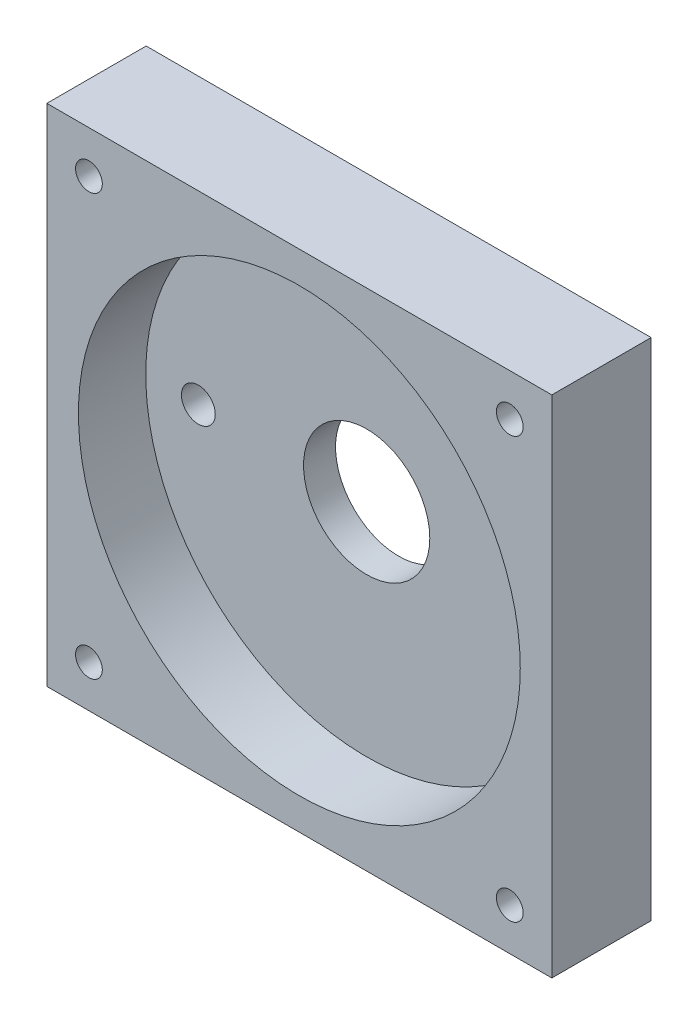
ISO-10303-21;
HEADER;
FILE_DESCRIPTION(('STEP AP214'),'2;1');
FILE_NAME('part.step','',(''),(''),'','','');
FILE_SCHEMA(('AUTOMOTIVE_DESIGN { 1 0 10303 214 1 1 1 1 }'));
ENDSEC;
DATA;
#1=APPLICATION_CONTEXT('core data for automotive mechanical design processes');
#2=APPLICATION_PROTOCOL_DEFINITION('international standard','automotive_design',2000,#1);
#3=PRODUCT_CONTEXT('',#1,'mechanical');
#4=PRODUCT('Part','Part','',(#3));
#5=PRODUCT_RELATED_PRODUCT_CATEGORY('part','',(#4));
#6=PRODUCT_DEFINITION_FORMATION('','',#4);
#7=PRODUCT_DEFINITION_CONTEXT('part definition',#1,'design');
#8=PRODUCT_DEFINITION('design','',#6,#7);
#9=PRODUCT_DEFINITION_SHAPE('','',#8);
#10=(LENGTH_UNIT() NAMED_UNIT(*) SI_UNIT(.MILLI.,.METRE.));
#11=(NAMED_UNIT(*) PLANE_ANGLE_UNIT() SI_UNIT($,.RADIAN.));
#12=(NAMED_UNIT(*) SI_UNIT($,.STERADIAN.) SOLID_ANGLE_UNIT());
#13=UNCERTAINTY_MEASURE_WITH_UNIT(LENGTH_MEASURE(1.E-05),#10,'distance_accuracy_value','');
#14=(GEOMETRIC_REPRESENTATION_CONTEXT(3) GLOBAL_UNCERTAINTY_ASSIGNED_CONTEXT((#13)) GLOBAL_UNIT_ASSIGNED_CONTEXT((#10,
#11,#12)) REPRESENTATION_CONTEXT('',''));
#15=CARTESIAN_POINT('',(0.,0.,0.));
#16=DIRECTION('',(0.,0.,1.));
#17=DIRECTION('',(1.,0.,0.));
#18=AXIS2_PLACEMENT_3D('',#15,#16,#17);
#19=CARTESIAN_POINT('',(38.1,-38.1,12.7));
#20=DIRECTION('',(-1.,0.,0.));
#21=DIRECTION('',(0.,0.,1.));
#22=AXIS2_PLACEMENT_3D('',#19,#20,#21);
#23=PLANE('',#22);
#24=DIRECTION('',(0.,0.,-1.));
#25=VECTOR('',#24,1.);
#26=CARTESIAN_POINT('',(38.1,-38.1,12.7));
#27=LINE('',#26,#25);
#28=CARTESIAN_POINT('',(38.1,-38.1,12.7));
#29=VERTEX_POINT('',#28);
#30=CARTESIAN_POINT('',(38.1,-38.1,-2.286));
#31=VERTEX_POINT('',#30);
#32=EDGE_CURVE('E96',#29,#31,#27,.T.);
#33=ORIENTED_EDGE('',*,*,#32,.T.);
#34=DIRECTION('',(0.,-1.,0.));
#35=VECTOR('',#34,1.);
#36=CARTESIAN_POINT('',(38.1,-38.1,-2.286));
#37=LINE('',#36,#35);
#38=CARTESIAN_POINT('',(38.1,38.1,-2.286));
#39=VERTEX_POINT('',#38);
#40=EDGE_CURVE('E95',#39,#31,#37,.T.);
#41=ORIENTED_EDGE('',*,*,#40,.F.);
#42=DIRECTION('',(0.,0.,-1.));
#43=VECTOR('',#42,1.);
#44=CARTESIAN_POINT('',(38.1,38.1,12.7));
#45=LINE('',#44,#43);
#46=CARTESIAN_POINT('',(38.1,38.1,12.7));
#47=VERTEX_POINT('',#46);
#48=EDGE_CURVE('E11',#47,#39,#45,.T.);
#49=ORIENTED_EDGE('',*,*,#48,.F.);
#50=DIRECTION('',(0.,1.,0.));
#51=VECTOR('',#50,1.);
#52=CARTESIAN_POINT('',(38.1,-38.1,12.7));
#53=LINE('',#52,#51);
#54=EDGE_CURVE('E144',#29,#47,#53,.T.);
#55=ORIENTED_EDGE('',*,*,#54,.F.);
#56=EDGE_LOOP('',(#33,#41,#49,#55));
#57=FACE_BOUND('',#56,.T.);
#58=ADVANCED_FACE('F41',(#57),#23,.F.);
#59=CARTESIAN_POINT('',(-38.1,38.1,12.7));
#60=DIRECTION('',(0.,-1.,0.));
#61=DIRECTION('',(0.,0.,-1.));
#62=AXIS2_PLACEMENT_3D('',#59,#60,#61);
#63=PLANE('',#62);
#64=ORIENTED_EDGE('',*,*,#48,.T.);
#65=DIRECTION('',(1.,0.,0.));
#66=VECTOR('',#65,1.);
#67=CARTESIAN_POINT('',(38.1,38.1,-2.286));
#68=LINE('',#67,#66);
#69=CARTESIAN_POINT('',(-38.1,38.1,-2.286));
#70=VERTEX_POINT('',#69);
#71=EDGE_CURVE('E90',#70,#39,#68,.T.);
#72=ORIENTED_EDGE('',*,*,#71,.F.);
#73=DIRECTION('',(0.,0.,-1.));
#74=VECTOR('',#73,1.);
#75=CARTESIAN_POINT('',(-38.1,38.1,12.7));
#76=LINE('',#75,#74);
#77=CARTESIAN_POINT('',(-38.1,38.1,12.7));
#78=VERTEX_POINT('',#77);
#79=EDGE_CURVE('E49',#78,#70,#76,.T.);
#80=ORIENTED_EDGE('',*,*,#79,.F.);
#81=DIRECTION('',(-1.,0.,0.));
#82=VECTOR('',#81,1.);
#83=CARTESIAN_POINT('',(-38.1,38.1,12.7));
#84=LINE('',#83,#82);
#85=EDGE_CURVE('E91',#47,#78,#84,.T.);
#86=ORIENTED_EDGE('',*,*,#85,.F.);
#87=EDGE_LOOP('',(#64,#72,#80,#86));
#88=FACE_BOUND('',#87,.T.);
#89=ADVANCED_FACE('F87',(#88),#63,.F.);
#90=CARTESIAN_POINT('',(-38.1,-38.1,12.7));
#91=DIRECTION('',(1.,0.,0.));
#92=DIRECTION('',(0.,0.,-1.));
#93=AXIS2_PLACEMENT_3D('',#90,#91,#92);
#94=PLANE('',#93);
#95=ORIENTED_EDGE('',*,*,#79,.T.);
#96=DIRECTION('',(0.,1.,0.));
#97=VECTOR('',#96,1.);
#98=CARTESIAN_POINT('',(-38.1,38.1,-2.286));
#99=LINE('',#98,#97);
#100=CARTESIAN_POINT('',(-38.1,-38.1,-2.286));
#101=VERTEX_POINT('',#100);
#102=EDGE_CURVE('E106',#101,#70,#99,.T.);
#103=ORIENTED_EDGE('',*,*,#102,.F.);
#104=DIRECTION('',(0.,0.,-1.));
#105=VECTOR('',#104,1.);
#106=CARTESIAN_POINT('',(-38.1,-38.1,12.7));
#107=LINE('',#106,#105);
#108=CARTESIAN_POINT('',(-38.1,-38.1,12.7));
#109=VERTEX_POINT('',#108);
#110=EDGE_CURVE('E156',#109,#101,#107,.T.);
#111=ORIENTED_EDGE('',*,*,#110,.F.);
#112=DIRECTION('',(0.,-1.,0.));
#113=VECTOR('',#112,1.);
#114=CARTESIAN_POINT('',(-38.1,-38.1,12.7));
#115=LINE('',#114,#113);
#116=EDGE_CURVE('E64',#78,#109,#115,.T.);
#117=ORIENTED_EDGE('',*,*,#116,.F.);
#118=EDGE_LOOP('',(#95,#103,#111,#117));
#119=FACE_BOUND('',#118,.T.);
#120=ADVANCED_FACE('F192',(#119),#94,.F.);
#121=CARTESIAN_POINT('',(-38.1,-38.1,12.7));
#122=DIRECTION('',(0.,1.,0.));
#123=DIRECTION('',(0.,0.,1.));
#124=AXIS2_PLACEMENT_3D('',#121,#122,#123);
#125=PLANE('',#124);
#126=ORIENTED_EDGE('',*,*,#110,.T.);
#127=DIRECTION('',(-1.,0.,0.));
#128=VECTOR('',#127,1.);
#129=CARTESIAN_POINT('',(-38.1,-38.1,-2.286));
#130=LINE('',#129,#128);
#131=EDGE_CURVE('E100',#31,#101,#130,.T.);
#132=ORIENTED_EDGE('',*,*,#131,.F.);
#133=ORIENTED_EDGE('',*,*,#32,.F.);
#134=DIRECTION('',(1.,0.,0.));
#135=VECTOR('',#134,1.);
#136=CARTESIAN_POINT('',(-38.1,-38.1,12.7));
#137=LINE('',#136,#135);
#138=EDGE_CURVE('E57',#109,#29,#137,.T.);
#139=ORIENTED_EDGE('',*,*,#138,.F.);
#140=EDGE_LOOP('',(#126,#132,#133,#139));
#141=FACE_BOUND('',#140,.T.);
#142=ADVANCED_FACE('F188',(#141),#125,.F.);
#143=CARTESIAN_POINT('',(0.,0.,12.7));
#144=DIRECTION('',(0.,0.,-1.));
#145=DIRECTION('',(-1.,0.,0.));
#146=AXIS2_PLACEMENT_3D('',#143,#144,#145);
#147=PLANE('',#146);
#148=CARTESIAN_POINT('',(-31.75,31.75,12.7));
#149=DIRECTION('',(0.,0.,1.));
#150=DIRECTION('',(1.,0.,0.));
#151=AXIS2_PLACEMENT_3D('',#148,#149,#150);
#152=CIRCLE('',#151,2.0193);
#153=CARTESIAN_POINT('',(-29.7307,31.75,12.7));
#154=VERTEX_POINT('',#153);
#155=EDGE_CURVE('E120',#154,#154,#152,.T.);
#156=ORIENTED_EDGE('',*,*,#155,.F.);
#157=EDGE_LOOP('',(#156));
#158=FACE_BOUND('',#157,.T.);
#159=CARTESIAN_POINT('',(-31.75,-31.75,12.7));
#160=DIRECTION('',(0.,0.,1.));
#161=DIRECTION('',(1.,0.,0.));
#162=AXIS2_PLACEMENT_3D('',#159,#160,#161);
#163=CIRCLE('',#162,2.0193);
#164=CARTESIAN_POINT('',(-29.7307,-31.75,12.7));
#165=VERTEX_POINT('',#164);
#166=EDGE_CURVE('E124',#165,#165,#163,.T.);
#167=ORIENTED_EDGE('',*,*,#166,.F.);
#168=EDGE_LOOP('',(#167));
#169=FACE_BOUND('',#168,.T.);
#170=CARTESIAN_POINT('',(31.75,-31.75,12.7));
#171=DIRECTION('',(0.,0.,1.));
#172=DIRECTION('',(1.,0.,0.));
#173=AXIS2_PLACEMENT_3D('',#170,#171,#172);
#174=CIRCLE('',#173,2.0193);
#175=CARTESIAN_POINT('',(33.7693,-31.75,12.7));
#176=VERTEX_POINT('',#175);
#177=EDGE_CURVE('E128',#176,#176,#174,.T.);
#178=ORIENTED_EDGE('',*,*,#177,.F.);
#179=EDGE_LOOP('',(#178));
#180=FACE_BOUND('',#179,.T.);
#181=CARTESIAN_POINT('',(31.75,31.75,12.7));
#182=DIRECTION('',(0.,0.,1.));
#183=DIRECTION('',(1.,0.,0.));
#184=AXIS2_PLACEMENT_3D('',#181,#182,#183);
#185=CIRCLE('',#184,2.0193);
#186=CARTESIAN_POINT('',(33.7693,31.75,12.7));
#187=VERTEX_POINT('',#186);
#188=EDGE_CURVE('E131',#187,#187,#185,.T.);
#189=ORIENTED_EDGE('',*,*,#188,.F.);
#190=EDGE_LOOP('',(#189));
#191=FACE_BOUND('',#190,.T.);
#192=CARTESIAN_POINT('',(0.,0.,12.7));
#193=DIRECTION('',(0.,0.,1.));
#194=DIRECTION('',(1.,0.,0.));
#195=AXIS2_PLACEMENT_3D('',#192,#193,#194);
#196=CIRCLE('',#195,33.3375);
#197=CARTESIAN_POINT('',(33.3375,0.,12.7));
#198=VERTEX_POINT('',#197);
#199=EDGE_CURVE('E138',#198,#198,#196,.T.);
#200=ORIENTED_EDGE('',*,*,#199,.F.);
#201=EDGE_LOOP('',(#200));
#202=FACE_BOUND('',#201,.T.);
#203=ORIENTED_EDGE('',*,*,#54,.T.);
#204=ORIENTED_EDGE('',*,*,#85,.T.);
#205=ORIENTED_EDGE('',*,*,#116,.T.);
#206=ORIENTED_EDGE('',*,*,#138,.T.);
#207=EDGE_LOOP('',(#203,#204,#205,#206));
#208=FACE_BOUND('',#207,.T.);
#209=ADVANCED_FACE('F183',(#158,#169,#180,#191,#202,#208),#147,.F.);
#210=CARTESIAN_POINT('',(0.,0.,2.54));
#211=DIRECTION('',(0.,0.,1.));
#212=DIRECTION('',(1.,0.,0.));
#213=AXIS2_PLACEMENT_3D('',#210,#211,#212);
#214=CYLINDRICAL_SURFACE('',#213,33.3375);
#215=CARTESIAN_POINT('',(0.,0.,2.54));
#216=DIRECTION('',(0.,0.,1.));
#217=DIRECTION('',(1.,0.,0.));
#218=AXIS2_PLACEMENT_3D('',#215,#216,#217);
#219=CIRCLE('',#218,33.3375);
#220=CARTESIAN_POINT('',(33.3375,0.,2.54));
#221=VERTEX_POINT('',#220);
#222=EDGE_CURVE('E140',#221,#221,#219,.T.);
#223=ORIENTED_EDGE('',*,*,#222,.F.);
#224=EDGE_LOOP('',(#223));
#225=FACE_BOUND('',#224,.T.);
#226=ORIENTED_EDGE('',*,*,#199,.T.);
#227=EDGE_LOOP('',(#226));
#228=FACE_BOUND('',#227,.T.);
#229=ADVANCED_FACE('F174',(#225,#228),#214,.F.);
#230=CARTESIAN_POINT('',(0.,0.,2.54));
#231=DIRECTION('',(0.,0.,1.));
#232=DIRECTION('',(1.,0.,0.));
#233=AXIS2_PLACEMENT_3D('',#230,#231,#232);
#234=PLANE('',#233);
#235=CARTESIAN_POINT('',(25.4,0.,2.54));
#236=DIRECTION('',(0.,0.,1.));
#237=DIRECTION('',(1.,0.,0.));
#238=AXIS2_PLACEMENT_3D('',#235,#236,#237);
#239=CIRCLE('',#238,2.5527);
#240=CARTESIAN_POINT('',(27.9527,0.,2.54));
#241=VERTEX_POINT('',#240);
#242=EDGE_CURVE('E44',#241,#241,#239,.T.);
#243=ORIENTED_EDGE('',*,*,#242,.F.);
#244=EDGE_LOOP('',(#243));
#245=FACE_BOUND('',#244,.T.);
#246=CARTESIAN_POINT('',(-25.4,0.,2.54));
#247=DIRECTION('',(0.,0.,1.));
#248=DIRECTION('',(1.,0.,0.));
#249=AXIS2_PLACEMENT_3D('',#246,#247,#248);
#250=CIRCLE('',#249,2.5527);
#251=CARTESIAN_POINT('',(-22.8473,0.,2.54));
#252=VERTEX_POINT('',#251);
#253=EDGE_CURVE('E139',#252,#252,#250,.T.);
#254=ORIENTED_EDGE('',*,*,#253,.F.);
#255=EDGE_LOOP('',(#254));
#256=FACE_BOUND('',#255,.T.);
#257=CARTESIAN_POINT('',(0.,0.,2.54));
#258=DIRECTION('',(0.,0.,1.));
#259=DIRECTION('',(1.,0.,0.));
#260=AXIS2_PLACEMENT_3D('',#257,#258,#259);
#261=CIRCLE('',#260,9.525);
#262=CARTESIAN_POINT('',(9.525,0.,2.54));
#263=VERTEX_POINT('',#262);
#264=EDGE_CURVE('E134',#263,#263,#261,.T.);
#265=ORIENTED_EDGE('',*,*,#264,.F.);
#266=EDGE_LOOP('',(#265));
#267=FACE_BOUND('',#266,.T.);
#268=ORIENTED_EDGE('',*,*,#222,.T.);
#269=EDGE_LOOP('',(#268));
#270=FACE_BOUND('',#269,.T.);
#271=ADVANCED_FACE('F170',(#245,#256,#267,#270),#234,.T.);
#272=CARTESIAN_POINT('',(0.,0.,-16.51));
#273=DIRECTION('',(0.,0.,1.));
#274=DIRECTION('',(1.,0.,0.));
#275=AXIS2_PLACEMENT_3D('',#272,#273,#274);
#276=CYLINDRICAL_SURFACE('',#275,9.525);
#277=CARTESIAN_POINT('',(0.,0.,-2.286));
#278=DIRECTION('',(0.,0.,-1.));
#279=DIRECTION('',(-1.,0.,0.));
#280=AXIS2_PLACEMENT_3D('',#277,#278,#279);
#281=CIRCLE('',#280,9.525);
#282=CARTESIAN_POINT('',(9.525,0.,-2.286));
#283=VERTEX_POINT('',#282);
#284=EDGE_CURVE('E368',#283,#283,#281,.T.);
#285=CARTESIAN_POINT('',(9.525,0.,2.54));
#286=CARTESIAN_POINT('',(9.525,0.,2.48972916666666));
#287=CARTESIAN_POINT('',(9.525,0.,2.43945833333333));
#288=CARTESIAN_POINT('',(9.525,0.,2.33891666666666));
#289=CARTESIAN_POINT('',(9.525,0.,2.28864583333333));
#290=CARTESIAN_POINT('',(9.525,0.,2.18810416666666));
#291=CARTESIAN_POINT('',(9.525,0.,2.13783333333333));
#292=CARTESIAN_POINT('',(9.525,0.,2.03729166666666));
#293=CARTESIAN_POINT('',(9.525,0.,1.98702083333333));
#294=CARTESIAN_POINT('',(9.525,0.,1.88647916666666));
#295=CARTESIAN_POINT('',(9.525,0.,1.83620833333333));
#296=CARTESIAN_POINT('',(9.525,0.,1.73566666666666));
#297=CARTESIAN_POINT('',(9.525,0.,1.68539583333333));
#298=CARTESIAN_POINT('',(9.525,0.,1.58485416666666));
#299=CARTESIAN_POINT('',(9.525,0.,1.53458333333333));
#300=CARTESIAN_POINT('',(9.525,0.,1.43404166666666));
#301=CARTESIAN_POINT('',(9.525,0.,1.38377083333333));
#302=CARTESIAN_POINT('',(9.525,0.,1.28322916666666));
#303=CARTESIAN_POINT('',(9.525,0.,1.23295833333333));
#304=CARTESIAN_POINT('',(9.525,0.,1.13241666666666));
#305=CARTESIAN_POINT('',(9.525,0.,1.08214583333333));
#306=CARTESIAN_POINT('',(9.525,0.,0.981604166666665));
#307=CARTESIAN_POINT('',(9.525,0.,0.931333333333331));
#308=CARTESIAN_POINT('',(9.525,0.,0.830791666666665));
#309=CARTESIAN_POINT('',(9.525,0.,0.780520833333332));
#310=CARTESIAN_POINT('',(9.525,0.,0.679979166666665));
#311=CARTESIAN_POINT('',(9.525,0.,0.629708333333332));
#312=CARTESIAN_POINT('',(9.525,0.,0.529166666666665));
#313=CARTESIAN_POINT('',(9.525,0.,0.478895833333332));
#314=CARTESIAN_POINT('',(9.525,0.,0.378354166666665));
#315=CARTESIAN_POINT('',(9.525,0.,0.328083333333332));
#316=CARTESIAN_POINT('',(9.525,0.,0.227541666666665));
#317=CARTESIAN_POINT('',(9.525,0.,0.177270833333332));
#318=CARTESIAN_POINT('',(9.525,0.,0.0767291666666653));
#319=CARTESIAN_POINT('',(9.525,0.,0.026458333333332));
#320=CARTESIAN_POINT('',(9.525,0.,-0.0740833333333346));
#321=CARTESIAN_POINT('',(9.525,0.,-0.124354166666668));
#322=CARTESIAN_POINT('',(9.525,0.,-0.224895833333334));
#323=CARTESIAN_POINT('',(9.525,0.,-0.275166666666668));
#324=CARTESIAN_POINT('',(9.525,0.,-0.375708333333334));
#325=CARTESIAN_POINT('',(9.525,0.,-0.425979166666668));
#326=CARTESIAN_POINT('',(9.525,0.,-0.526520833333334));
#327=CARTESIAN_POINT('',(9.525,0.,-0.576791666666668));
#328=CARTESIAN_POINT('',(9.525,0.,-0.677333333333334));
#329=CARTESIAN_POINT('',(9.525,0.,-0.727604166666667));
#330=CARTESIAN_POINT('',(9.525,0.,-0.828145833333333));
#331=CARTESIAN_POINT('',(9.525,0.,-0.878416666666666));
#332=CARTESIAN_POINT('',(9.525,0.,-0.978958333333332));
#333=CARTESIAN_POINT('',(9.525,0.,-1.02922916666667));
#334=CARTESIAN_POINT('',(9.525,0.,-1.12977083333333));
#335=CARTESIAN_POINT('',(9.525,0.,-1.18004166666667));
#336=CARTESIAN_POINT('',(9.525,0.,-1.28058333333333));
#337=CARTESIAN_POINT('',(9.525,0.,-1.33085416666667));
#338=CARTESIAN_POINT('',(9.525,0.,-1.43139583333333));
#339=CARTESIAN_POINT('',(9.525,0.,-1.48166666666667));
#340=CARTESIAN_POINT('',(9.525,0.,-1.58220833333333));
#341=CARTESIAN_POINT('',(9.525,0.,-1.63247916666667));
#342=CARTESIAN_POINT('',(9.525,0.,-1.73302083333333));
#343=CARTESIAN_POINT('',(9.525,0.,-1.78329166666666));
#344=CARTESIAN_POINT('',(9.525,0.,-1.88383333333333));
#345=CARTESIAN_POINT('',(9.525,0.,-1.93410416666666));
#346=CARTESIAN_POINT('',(9.525,0.,-2.03464583333333));
#347=CARTESIAN_POINT('',(9.525,0.,-2.08491666666667));
#348=CARTESIAN_POINT('',(9.525,0.,-2.18545833333333));
#349=CARTESIAN_POINT('',(9.525,0.,-2.23572916666666));
#350=CARTESIAN_POINT('',(9.525,0.,-2.286));
#351=B_SPLINE_CURVE_WITH_KNOTS('',3,(#285,#286,#287,#288,#289,#290,#291,#292,#293,#294,#295,
#296,#297,#298,#299,#300,#301,#302,#303,#304,#305,#306,#307,#308,#309,#310,#311,#312,#313,#314,
#315,#316,#317,#318,#319,#320,#321,#322,#323,#324,#325,#326,#327,#328,#329,#330,#331,#332,#333,
#334,#335,#336,#337,#338,#339,#340,#341,#342,#343,#344,#345,#346,#347,#348,#349,#350),
.UNSPECIFIED.,.F.,.F.,(4,2,2,2,2,2,2,2,2,2,2,2,2,2,2,2,2,2,2,2,2,2,2,2,2,2,2,2,2,2,2,2,4),(0.,
0.1508125,0.301625,0.4524375,0.60325,0.7540625,0.904874999999999,1.0556875,1.2065,1.3573125,
1.508125,1.6589375,1.80975,1.9605625,2.111375,2.2621875,2.413,2.5638125,2.714625,2.8654375,
3.01625,3.1670625,3.317875,3.4686875,3.6195,3.7703125,3.921125,4.0719375,4.22275,4.3735625,
4.524375,4.6751875,4.826),.UNSPECIFIED.);
#352=EDGE_CURVE('BSEAM173',#263,#283,#351,.T.);
#353=ORIENTED_EDGE('',*,*,#264,.T.);
#354=ORIENTED_EDGE('',*,*,#284,.T.);
#355=ORIENTED_EDGE('',*,*,#352,.T.);
#356=ORIENTED_EDGE('',*,*,#352,.F.);
#357=EDGE_LOOP('',(#353,#355,#354,#356));
#358=FACE_BOUND('',#357,.T.);
#359=ADVANCED_FACE('F173',(#358),#276,.F.);
#360=CARTESIAN_POINT('',(-25.4,0.,0.));
#361=DIRECTION('',(0.,0.,1.));
#362=DIRECTION('',(1.,0.,0.));
#363=AXIS2_PLACEMENT_3D('',#360,#361,#362);
#364=CYLINDRICAL_SURFACE('',#363,2.5527);
#365=ORIENTED_EDGE('',*,*,#253,.T.);
#366=EDGE_LOOP('',(#365));
#367=FACE_BOUND('',#366,.T.);
#368=CARTESIAN_POINT('',(-25.4,0.,-2.286));
#369=DIRECTION('',(0.,0.,-1.));
#370=DIRECTION('',(-1.,0.,0.));
#371=AXIS2_PLACEMENT_3D('',#368,#369,#370);
#372=CIRCLE('',#371,2.5527);
#373=CARTESIAN_POINT('',(-27.9527,0.,-2.286));
#374=VERTEX_POINT('',#373);
#375=EDGE_CURVE('E364',#374,#374,#372,.T.);
#376=ORIENTED_EDGE('',*,*,#375,.T.);
#377=EDGE_LOOP('',(#376));
#378=FACE_BOUND('',#377,.T.);
#379=ADVANCED_FACE('F252',(#367,#378),#364,.F.);
#380=CARTESIAN_POINT('',(25.4,0.,0.));
#381=DIRECTION('',(0.,0.,1.));
#382=DIRECTION('',(1.,0.,0.));
#383=AXIS2_PLACEMENT_3D('',#380,#381,#382);
#384=CYLINDRICAL_SURFACE('',#383,2.5527);
#385=ORIENTED_EDGE('',*,*,#242,.T.);
#386=EDGE_LOOP('',(#385));
#387=FACE_BOUND('',#386,.T.);
#388=CARTESIAN_POINT('',(25.4,0.,-2.286));
#389=DIRECTION('',(0.,0.,-1.));
#390=DIRECTION('',(-1.,0.,0.));
#391=AXIS2_PLACEMENT_3D('',#388,#389,#390);
#392=CIRCLE('',#391,2.5527);
#393=CARTESIAN_POINT('',(22.8473,0.,-2.286));
#394=VERTEX_POINT('',#393);
#395=EDGE_CURVE('E108',#394,#394,#392,.T.);
#396=ORIENTED_EDGE('',*,*,#395,.T.);
#397=EDGE_LOOP('',(#396));
#398=FACE_BOUND('',#397,.T.);
#399=ADVANCED_FACE('F167',(#387,#398),#384,.F.);
#400=CARTESIAN_POINT('',(31.75,31.75,12.7));
#401=DIRECTION('',(0.,0.,1.));
#402=DIRECTION('',(1.,0.,0.));
#403=AXIS2_PLACEMENT_3D('',#400,#401,#402);
#404=CYLINDRICAL_SURFACE('',#403,2.0193);
#405=ORIENTED_EDGE('',*,*,#188,.T.);
#406=EDGE_LOOP('',(#405));
#407=FACE_BOUND('',#406,.T.);
#408=CARTESIAN_POINT('',(31.75,31.75,-2.286));
#409=DIRECTION('',(0.,0.,-1.));
#410=DIRECTION('',(-1.,0.,0.));
#411=AXIS2_PLACEMENT_3D('',#408,#409,#410);
#412=CIRCLE('',#411,2.0193);
#413=CARTESIAN_POINT('',(29.7307,31.75,-2.286));
#414=VERTEX_POINT('',#413);
#415=EDGE_CURVE('E113',#414,#414,#412,.T.);
#416=ORIENTED_EDGE('',*,*,#415,.T.);
#417=EDGE_LOOP('',(#416));
#418=FACE_BOUND('',#417,.T.);
#419=ADVANCED_FACE('F272',(#407,#418),#404,.F.);
#420=CARTESIAN_POINT('',(31.75,-31.75,12.7));
#421=DIRECTION('',(0.,0.,1.));
#422=DIRECTION('',(1.,0.,0.));
#423=AXIS2_PLACEMENT_3D('',#420,#421,#422);
#424=CYLINDRICAL_SURFACE('',#423,2.0193);
#425=ORIENTED_EDGE('',*,*,#177,.T.);
#426=EDGE_LOOP('',(#425));
#427=FACE_BOUND('',#426,.T.);
#428=CARTESIAN_POINT('',(31.75,-31.75,-2.286));
#429=DIRECTION('',(0.,0.,-1.));
#430=DIRECTION('',(-1.,0.,0.));
#431=AXIS2_PLACEMENT_3D('',#428,#429,#430);
#432=CIRCLE('',#431,2.0193);
#433=CARTESIAN_POINT('',(29.7307,-31.75,-2.286));
#434=VERTEX_POINT('',#433);
#435=EDGE_CURVE('E372',#434,#434,#432,.T.);
#436=ORIENTED_EDGE('',*,*,#435,.T.);
#437=EDGE_LOOP('',(#436));
#438=FACE_BOUND('',#437,.T.);
#439=ADVANCED_FACE('F282',(#427,#438),#424,.F.);
#440=CARTESIAN_POINT('',(-31.75,-31.75,12.7));
#441=DIRECTION('',(0.,0.,1.));
#442=DIRECTION('',(1.,0.,0.));
#443=AXIS2_PLACEMENT_3D('',#440,#441,#442);
#444=CYLINDRICAL_SURFACE('',#443,2.0193);
#445=ORIENTED_EDGE('',*,*,#166,.T.);
#446=EDGE_LOOP('',(#445));
#447=FACE_BOUND('',#446,.T.);
#448=CARTESIAN_POINT('',(-31.75,-31.75,-2.286));
#449=DIRECTION('',(0.,0.,-1.));
#450=DIRECTION('',(-1.,0.,0.));
#451=AXIS2_PLACEMENT_3D('',#448,#449,#450);
#452=CIRCLE('',#451,2.0193);
#453=CARTESIAN_POINT('',(-33.7693,-31.75,-2.286));
#454=VERTEX_POINT('',#453);
#455=EDGE_CURVE('E365',#454,#454,#452,.T.);
#456=ORIENTED_EDGE('',*,*,#455,.T.);
#457=EDGE_LOOP('',(#456));
#458=FACE_BOUND('',#457,.T.);
#459=ADVANCED_FACE('F216',(#447,#458),#444,.F.);
#460=CARTESIAN_POINT('',(-31.75,31.75,12.7));
#461=DIRECTION('',(0.,0.,1.));
#462=DIRECTION('',(1.,0.,0.));
#463=AXIS2_PLACEMENT_3D('',#460,#461,#462);
#464=CYLINDRICAL_SURFACE('',#463,2.0193);
#465=ORIENTED_EDGE('',*,*,#155,.T.);
#466=EDGE_LOOP('',(#465));
#467=FACE_BOUND('',#466,.T.);
#468=CARTESIAN_POINT('',(-31.75,31.75,-2.286));
#469=DIRECTION('',(0.,0.,-1.));
#470=DIRECTION('',(-1.,0.,0.));
#471=AXIS2_PLACEMENT_3D('',#468,#469,#470);
#472=CIRCLE('',#471,2.0193);
#473=CARTESIAN_POINT('',(-33.7693,31.75,-2.286));
#474=VERTEX_POINT('',#473);
#475=EDGE_CURVE('E361',#474,#474,#472,.T.);
#476=ORIENTED_EDGE('',*,*,#475,.T.);
#477=EDGE_LOOP('',(#476));
#478=FACE_BOUND('',#477,.T.);
#479=ADVANCED_FACE('F222',(#467,#478),#464,.F.);
#480=CARTESIAN_POINT('',(0.,0.,-2.286));
#481=DIRECTION('',(0.,0.,1.));
#482=DIRECTION('',(1.,0.,0.));
#483=AXIS2_PLACEMENT_3D('',#480,#481,#482);
#484=PLANE('',#483);
#485=ORIENTED_EDGE('',*,*,#71,.T.);
#486=ORIENTED_EDGE('',*,*,#40,.T.);
#487=ORIENTED_EDGE('',*,*,#131,.T.);
#488=ORIENTED_EDGE('',*,*,#102,.T.);
#489=EDGE_LOOP('',(#485,#486,#487,#488));
#490=FACE_BOUND('',#489,.T.);
#491=ORIENTED_EDGE('',*,*,#395,.F.);
#492=EDGE_LOOP('',(#491));
#493=FACE_BOUND('',#492,.T.);
#494=ORIENTED_EDGE('',*,*,#415,.F.);
#495=EDGE_LOOP('',(#494));
#496=FACE_BOUND('',#495,.T.);
#497=ORIENTED_EDGE('',*,*,#284,.F.);
#498=EDGE_LOOP('',(#497));
#499=FACE_BOUND('',#498,.T.);
#500=ORIENTED_EDGE('',*,*,#375,.F.);
#501=EDGE_LOOP('',(#500));
#502=FACE_BOUND('',#501,.T.);
#503=ORIENTED_EDGE('',*,*,#475,.F.);
#504=EDGE_LOOP('',(#503));
#505=FACE_BOUND('',#504,.T.);
#506=ORIENTED_EDGE('',*,*,#455,.F.);
#507=EDGE_LOOP('',(#506));
#508=FACE_BOUND('',#507,.T.);
#509=ORIENTED_EDGE('',*,*,#435,.F.);
#510=EDGE_LOOP('',(#509));
#511=FACE_BOUND('',#510,.T.);
#512=ADVANCED_FACE('F103',(#490,#493,#496,#499,#502,#505,#508,#511),#484,.F.);
#513=CLOSED_SHELL('',(#58,#89,#120,#142,#209,#229,#271,#359,#379,#399,#419,#439,#459,#479,#512));
#514=MANIFOLD_SOLID_BREP('B2',#513);
#515=ADVANCED_BREP_SHAPE_REPRESENTATION('',(#18,#514),#14);
#516=SHAPE_DEFINITION_REPRESENTATION(#9,#515);
ENDSEC;
END-ISO-10303-21;
